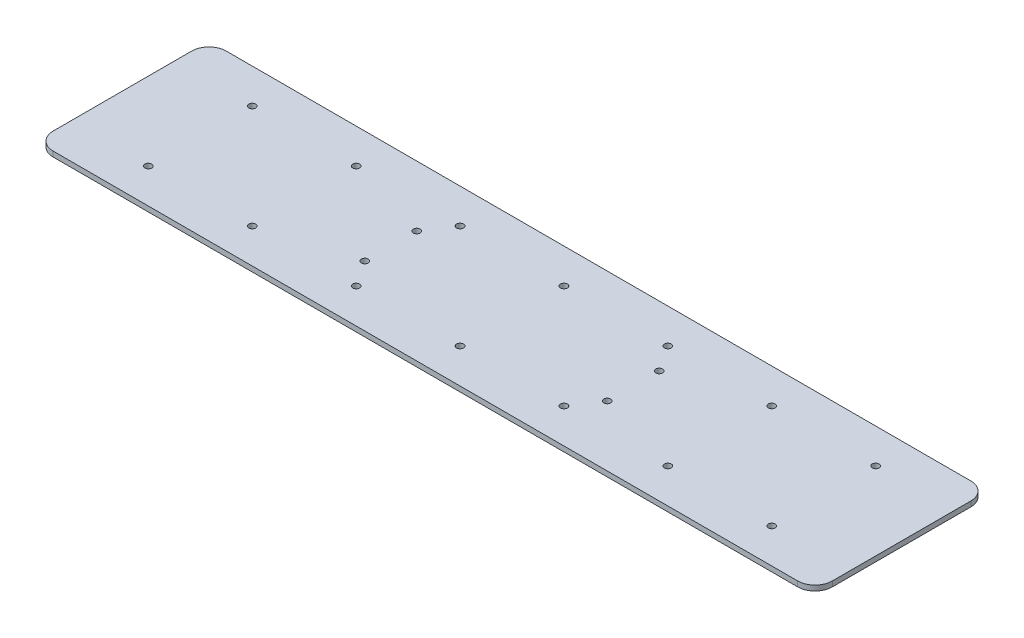
ISO-10303-21;
HEADER;
FILE_DESCRIPTION(('STEP AP214'),'2;1');
FILE_NAME('part.step','',(''),(''),'','','');
FILE_SCHEMA(('AUTOMOTIVE_DESIGN { 1 0 10303 214 1 1 1 1 }'));
ENDSEC;
DATA;
#1=APPLICATION_CONTEXT('core data for automotive mechanical design processes');
#2=APPLICATION_PROTOCOL_DEFINITION('international standard','automotive_design',2000,#1);
#3=PRODUCT_CONTEXT('',#1,'mechanical');
#4=PRODUCT('Part','Part','',(#3));
#5=PRODUCT_RELATED_PRODUCT_CATEGORY('part','',(#4));
#6=PRODUCT_DEFINITION_FORMATION('','',#4);
#7=PRODUCT_DEFINITION_CONTEXT('part definition',#1,'design');
#8=PRODUCT_DEFINITION('design','',#6,#7);
#9=PRODUCT_DEFINITION_SHAPE('','',#8);
#10=(LENGTH_UNIT() NAMED_UNIT(*) SI_UNIT(.MILLI.,.METRE.));
#11=(NAMED_UNIT(*) PLANE_ANGLE_UNIT() SI_UNIT($,.RADIAN.));
#12=(NAMED_UNIT(*) SI_UNIT($,.STERADIAN.) SOLID_ANGLE_UNIT());
#13=UNCERTAINTY_MEASURE_WITH_UNIT(LENGTH_MEASURE(1.E-05),#10,'distance_accuracy_value','');
#14=(GEOMETRIC_REPRESENTATION_CONTEXT(3) GLOBAL_UNCERTAINTY_ASSIGNED_CONTEXT((#13)) GLOBAL_UNIT_ASSIGNED_CONTEXT((#10,
#11,#12)) REPRESENTATION_CONTEXT('',''));
#15=CARTESIAN_POINT('',(0.,0.,0.));
#16=DIRECTION('',(0.,0.,1.));
#17=DIRECTION('',(1.,0.,0.));
#18=AXIS2_PLACEMENT_3D('',#15,#16,#17);
#19=CARTESIAN_POINT('',(215.,3.,40.));
#20=DIRECTION('',(0.,-1.,0.));
#21=DIRECTION('',(0.,0.,-1.));
#22=AXIS2_PLACEMENT_3D('',#19,#20,#21);
#23=CYLINDRICAL_SURFACE('',#22,10.);
#24=CARTESIAN_POINT('',(215.,0.,40.));
#25=DIRECTION('',(0.,1.,0.));
#26=DIRECTION('',(0.,0.,1.));
#27=AXIS2_PLACEMENT_3D('',#24,#25,#26);
#28=CIRCLE('',#27,10.);
#29=CARTESIAN_POINT('',(215.,0.,50.));
#30=VERTEX_POINT('',#29);
#31=CARTESIAN_POINT('',(225.,0.,39.9999999999999));
#32=VERTEX_POINT('',#31);
#33=EDGE_CURVE('E128',#30,#32,#28,.T.);
#34=ORIENTED_EDGE('',*,*,#33,.T.);
#35=DIRECTION('',(0.,-1.,0.));
#36=VECTOR('',#35,1.);
#37=CARTESIAN_POINT('',(225.,3.,39.9999999999999));
#38=LINE('',#37,#36);
#39=CARTESIAN_POINT('',(225.,3.,39.9999999999999));
#40=VERTEX_POINT('',#39);
#41=EDGE_CURVE('E11',#40,#32,#38,.T.);
#42=ORIENTED_EDGE('',*,*,#41,.F.);
#43=CARTESIAN_POINT('',(215.,3.,40.));
#44=DIRECTION('',(0.,1.,0.));
#45=DIRECTION('',(0.,0.,1.));
#46=AXIS2_PLACEMENT_3D('',#43,#44,#45);
#47=CIRCLE('',#46,10.);
#48=CARTESIAN_POINT('',(215.,3.,50.));
#49=VERTEX_POINT('',#48);
#50=EDGE_CURVE('E143',#49,#40,#47,.T.);
#51=ORIENTED_EDGE('',*,*,#50,.F.);
#52=DIRECTION('',(0.,-1.,0.));
#53=VECTOR('',#52,1.);
#54=CARTESIAN_POINT('',(215.,3.,50.));
#55=LINE('',#54,#53);
#56=EDGE_CURVE('E124',#49,#30,#55,.T.);
#57=ORIENTED_EDGE('',*,*,#56,.T.);
#58=EDGE_LOOP('',(#34,#42,#51,#57));
#59=FACE_BOUND('',#58,.T.);
#60=ADVANCED_FACE('F32',(#59),#23,.T.);
#61=CARTESIAN_POINT('',(225.,3.,-39.9999999999999));
#62=DIRECTION('',(-1.,0.,0.));
#63=DIRECTION('',(0.,0.,1.));
#64=AXIS2_PLACEMENT_3D('',#61,#62,#63);
#65=PLANE('',#64);
#66=DIRECTION('',(0.,0.,-1.));
#67=VECTOR('',#66,1.);
#68=CARTESIAN_POINT('',(225.,0.,-39.9999999999999));
#69=LINE('',#68,#67);
#70=CARTESIAN_POINT('',(225.,0.,-39.9999999999999));
#71=VERTEX_POINT('',#70);
#72=EDGE_CURVE('E131',#32,#71,#69,.T.);
#73=ORIENTED_EDGE('',*,*,#72,.T.);
#74=DIRECTION('',(0.,-1.,0.));
#75=VECTOR('',#74,1.);
#76=CARTESIAN_POINT('',(225.,3.,-39.9999999999999));
#77=LINE('',#76,#75);
#78=CARTESIAN_POINT('',(225.,3.,-39.9999999999999));
#79=VERTEX_POINT('',#78);
#80=EDGE_CURVE('E40',#79,#71,#77,.T.);
#81=ORIENTED_EDGE('',*,*,#80,.F.);
#82=DIRECTION('',(0.,0.,-1.));
#83=VECTOR('',#82,1.);
#84=CARTESIAN_POINT('',(225.,3.,-39.9999999999999));
#85=LINE('',#84,#83);
#86=EDGE_CURVE('E91',#40,#79,#85,.T.);
#87=ORIENTED_EDGE('',*,*,#86,.F.);
#88=ORIENTED_EDGE('',*,*,#41,.T.);
#89=EDGE_LOOP('',(#73,#81,#87,#88));
#90=FACE_BOUND('',#89,.T.);
#91=ADVANCED_FACE('F345',(#90),#65,.F.);
#92=CARTESIAN_POINT('',(215.,3.,-40.));
#93=DIRECTION('',(0.,-1.,0.));
#94=DIRECTION('',(0.,0.,-1.));
#95=AXIS2_PLACEMENT_3D('',#92,#93,#94);
#96=CYLINDRICAL_SURFACE('',#95,10.);
#97=CARTESIAN_POINT('',(215.,0.,-40.));
#98=DIRECTION('',(0.,1.,0.));
#99=DIRECTION('',(0.,0.,1.));
#100=AXIS2_PLACEMENT_3D('',#97,#98,#99);
#101=CIRCLE('',#100,10.);
#102=CARTESIAN_POINT('',(215.,0.,-50.));
#103=VERTEX_POINT('',#102);
#104=EDGE_CURVE('E134',#71,#103,#101,.T.);
#105=ORIENTED_EDGE('',*,*,#104,.T.);
#106=DIRECTION('',(0.,-1.,0.));
#107=VECTOR('',#106,1.);
#108=CARTESIAN_POINT('',(215.,3.,-50.));
#109=LINE('',#108,#107);
#110=CARTESIAN_POINT('',(215.,3.,-50.));
#111=VERTEX_POINT('',#110);
#112=EDGE_CURVE('E150',#111,#103,#109,.T.);
#113=ORIENTED_EDGE('',*,*,#112,.F.);
#114=CARTESIAN_POINT('',(215.,3.,-40.));
#115=DIRECTION('',(0.,1.,0.));
#116=DIRECTION('',(0.,0.,1.));
#117=AXIS2_PLACEMENT_3D('',#114,#115,#116);
#118=CIRCLE('',#117,10.);
#119=EDGE_CURVE('E158',#79,#111,#118,.T.);
#120=ORIENTED_EDGE('',*,*,#119,.F.);
#121=ORIENTED_EDGE('',*,*,#80,.T.);
#122=EDGE_LOOP('',(#105,#113,#120,#121));
#123=FACE_BOUND('',#122,.T.);
#124=ADVANCED_FACE('F156',(#123),#96,.T.);
#125=CARTESIAN_POINT('',(-215.,3.,-50.));
#126=DIRECTION('',(0.,0.,1.));
#127=DIRECTION('',(1.,0.,0.));
#128=AXIS2_PLACEMENT_3D('',#125,#126,#127);
#129=PLANE('',#128);
#130=DIRECTION('',(-1.,0.,0.));
#131=VECTOR('',#130,1.);
#132=CARTESIAN_POINT('',(-215.,0.,-50.));
#133=LINE('',#132,#131);
#134=CARTESIAN_POINT('',(-215.,0.,-50.));
#135=VERTEX_POINT('',#134);
#136=EDGE_CURVE('E136',#103,#135,#133,.T.);
#137=ORIENTED_EDGE('',*,*,#136,.T.);
#138=DIRECTION('',(0.,-1.,0.));
#139=VECTOR('',#138,1.);
#140=CARTESIAN_POINT('',(-215.,3.,-50.));
#141=LINE('',#140,#139);
#142=CARTESIAN_POINT('',(-215.,3.,-50.));
#143=VERTEX_POINT('',#142);
#144=EDGE_CURVE('E147',#143,#135,#141,.T.);
#145=ORIENTED_EDGE('',*,*,#144,.F.);
#146=DIRECTION('',(-1.,0.,0.));
#147=VECTOR('',#146,1.);
#148=CARTESIAN_POINT('',(-215.,3.,-50.));
#149=LINE('',#148,#147);
#150=EDGE_CURVE('E170',#111,#143,#149,.T.);
#151=ORIENTED_EDGE('',*,*,#150,.F.);
#152=ORIENTED_EDGE('',*,*,#112,.T.);
#153=EDGE_LOOP('',(#137,#145,#151,#152));
#154=FACE_BOUND('',#153,.T.);
#155=ADVANCED_FACE('F166',(#154),#129,.F.);
#156=CARTESIAN_POINT('',(-215.,3.,-40.));
#157=DIRECTION('',(0.,-1.,0.));
#158=DIRECTION('',(0.,0.,-1.));
#159=AXIS2_PLACEMENT_3D('',#156,#157,#158);
#160=CYLINDRICAL_SURFACE('',#159,10.);
#161=CARTESIAN_POINT('',(-215.,0.,-40.));
#162=DIRECTION('',(0.,1.,0.));
#163=DIRECTION('',(0.,0.,-1.));
#164=AXIS2_PLACEMENT_3D('',#161,#162,#163);
#165=CIRCLE('',#164,10.);
#166=CARTESIAN_POINT('',(-225.,0.,-39.9999999999999));
#167=VERTEX_POINT('',#166);
#168=EDGE_CURVE('E138',#135,#167,#165,.T.);
#169=ORIENTED_EDGE('',*,*,#168,.T.);
#170=DIRECTION('',(0.,-1.,0.));
#171=VECTOR('',#170,1.);
#172=CARTESIAN_POINT('',(-225.,3.,-39.9999999999999));
#173=LINE('',#172,#171);
#174=CARTESIAN_POINT('',(-225.,3.,-39.9999999999999));
#175=VERTEX_POINT('',#174);
#176=EDGE_CURVE('E119',#175,#167,#173,.T.);
#177=ORIENTED_EDGE('',*,*,#176,.F.);
#178=CARTESIAN_POINT('',(-215.,3.,-40.));
#179=DIRECTION('',(0.,1.,0.));
#180=DIRECTION('',(0.,0.,-1.));
#181=AXIS2_PLACEMENT_3D('',#178,#179,#180);
#182=CIRCLE('',#181,10.);
#183=EDGE_CURVE('E110',#143,#175,#182,.T.);
#184=ORIENTED_EDGE('',*,*,#183,.F.);
#185=ORIENTED_EDGE('',*,*,#144,.T.);
#186=EDGE_LOOP('',(#169,#177,#184,#185));
#187=FACE_BOUND('',#186,.T.);
#188=ADVANCED_FACE('F169',(#187),#160,.T.);
#189=CARTESIAN_POINT('',(-225.,3.,-39.9999999999999));
#190=DIRECTION('',(1.,0.,0.));
#191=DIRECTION('',(0.,0.,-1.));
#192=AXIS2_PLACEMENT_3D('',#189,#190,#191);
#193=PLANE('',#192);
#194=DIRECTION('',(0.,0.,1.));
#195=VECTOR('',#194,1.);
#196=CARTESIAN_POINT('',(-225.,0.,-39.9999999999999));
#197=LINE('',#196,#195);
#198=CARTESIAN_POINT('',(-225.,0.,39.9999999999999));
#199=VERTEX_POINT('',#198);
#200=EDGE_CURVE('E118',#167,#199,#197,.T.);
#201=ORIENTED_EDGE('',*,*,#200,.T.);
#202=DIRECTION('',(0.,-1.,0.));
#203=VECTOR('',#202,1.);
#204=CARTESIAN_POINT('',(-225.,3.,39.9999999999999));
#205=LINE('',#204,#203);
#206=CARTESIAN_POINT('',(-225.,3.,39.9999999999999));
#207=VERTEX_POINT('',#206);
#208=EDGE_CURVE('E115',#207,#199,#205,.T.);
#209=ORIENTED_EDGE('',*,*,#208,.F.);
#210=DIRECTION('',(0.,0.,1.));
#211=VECTOR('',#210,1.);
#212=CARTESIAN_POINT('',(-225.,3.,-39.9999999999999));
#213=LINE('',#212,#211);
#214=EDGE_CURVE('E104',#175,#207,#213,.T.);
#215=ORIENTED_EDGE('',*,*,#214,.F.);
#216=ORIENTED_EDGE('',*,*,#176,.T.);
#217=EDGE_LOOP('',(#201,#209,#215,#216));
#218=FACE_BOUND('',#217,.T.);
#219=ADVANCED_FACE('F116',(#218),#193,.F.);
#220=CARTESIAN_POINT('',(-215.,3.,40.));
#221=DIRECTION('',(0.,-1.,0.));
#222=DIRECTION('',(0.,0.,-1.));
#223=AXIS2_PLACEMENT_3D('',#220,#221,#222);
#224=CYLINDRICAL_SURFACE('',#223,10.);
#225=CARTESIAN_POINT('',(-215.,0.,40.));
#226=DIRECTION('',(0.,1.,0.));
#227=DIRECTION('',(0.,0.,1.));
#228=AXIS2_PLACEMENT_3D('',#225,#226,#227);
#229=CIRCLE('',#228,10.);
#230=CARTESIAN_POINT('',(-215.,0.,50.));
#231=VERTEX_POINT('',#230);
#232=EDGE_CURVE('E77',#199,#231,#229,.T.);
#233=ORIENTED_EDGE('',*,*,#232,.T.);
#234=DIRECTION('',(0.,-1.,0.));
#235=VECTOR('',#234,1.);
#236=CARTESIAN_POINT('',(-215.,3.,50.));
#237=LINE('',#236,#235);
#238=CARTESIAN_POINT('',(-215.,3.,50.));
#239=VERTEX_POINT('',#238);
#240=EDGE_CURVE('E120',#239,#231,#237,.T.);
#241=ORIENTED_EDGE('',*,*,#240,.F.);
#242=CARTESIAN_POINT('',(-215.,3.,40.));
#243=DIRECTION('',(0.,1.,0.));
#244=DIRECTION('',(0.,0.,1.));
#245=AXIS2_PLACEMENT_3D('',#242,#243,#244);
#246=CIRCLE('',#245,10.);
#247=EDGE_CURVE('E108',#207,#239,#246,.T.);
#248=ORIENTED_EDGE('',*,*,#247,.F.);
#249=ORIENTED_EDGE('',*,*,#208,.T.);
#250=EDGE_LOOP('',(#233,#241,#248,#249));
#251=FACE_BOUND('',#250,.T.);
#252=ADVANCED_FACE('F122',(#251),#224,.T.);
#253=CARTESIAN_POINT('',(-215.,3.,50.));
#254=DIRECTION('',(0.,0.,-1.));
#255=DIRECTION('',(-1.,0.,0.));
#256=AXIS2_PLACEMENT_3D('',#253,#254,#255);
#257=PLANE('',#256);
#258=DIRECTION('',(1.,0.,0.));
#259=VECTOR('',#258,1.);
#260=CARTESIAN_POINT('',(-215.,0.,50.));
#261=LINE('',#260,#259);
#262=EDGE_CURVE('E83',#231,#30,#261,.T.);
#263=ORIENTED_EDGE('',*,*,#262,.T.);
#264=ORIENTED_EDGE('',*,*,#56,.F.);
#265=DIRECTION('',(1.,0.,0.));
#266=VECTOR('',#265,1.);
#267=CARTESIAN_POINT('',(-215.,3.,50.));
#268=LINE('',#267,#266);
#269=EDGE_CURVE('E48',#239,#49,#268,.T.);
#270=ORIENTED_EDGE('',*,*,#269,.F.);
#271=ORIENTED_EDGE('',*,*,#240,.T.);
#272=EDGE_LOOP('',(#263,#264,#270,#271));
#273=FACE_BOUND('',#272,.T.);
#274=ADVANCED_FACE('F296',(#273),#257,.F.);
#275=CARTESIAN_POINT('',(215.,3.,40.));
#276=DIRECTION('',(0.,1.,0.));
#277=DIRECTION('',(0.,0.,1.));
#278=AXIS2_PLACEMENT_3D('',#275,#276,#277);
#279=PLANE('',#278);
#280=CARTESIAN_POINT('',(70.,3.,-15.));
#281=DIRECTION('',(0.,1.,0.));
#282=DIRECTION('',(0.,0.,1.));
#283=AXIS2_PLACEMENT_3D('',#280,#281,#282);
#284=CIRCLE('',#283,2.);
#285=CARTESIAN_POINT('',(70.,3.,-13.));
#286=VERTEX_POINT('',#285);
#287=EDGE_CURVE('E273',#286,#286,#284,.T.);
#288=ORIENTED_EDGE('',*,*,#287,.F.);
#289=EDGE_LOOP('',(#288));
#290=FACE_BOUND('',#289,.T.);
#291=CARTESIAN_POINT('',(-70.,3.,15.));
#292=DIRECTION('',(0.,1.,0.));
#293=DIRECTION('',(0.,0.,1.));
#294=AXIS2_PLACEMENT_3D('',#291,#292,#293);
#295=CIRCLE('',#294,2.);
#296=CARTESIAN_POINT('',(-70.,3.,17.));
#297=VERTEX_POINT('',#296);
#298=EDGE_CURVE('E266',#297,#297,#295,.T.);
#299=ORIENTED_EDGE('',*,*,#298,.F.);
#300=EDGE_LOOP('',(#299));
#301=FACE_BOUND('',#300,.T.);
#302=CARTESIAN_POINT('',(70.,3.,15.));
#303=DIRECTION('',(0.,1.,0.));
#304=DIRECTION('',(0.,0.,1.));
#305=AXIS2_PLACEMENT_3D('',#302,#303,#304);
#306=CIRCLE('',#305,2.);
#307=CARTESIAN_POINT('',(70.,3.,17.));
#308=VERTEX_POINT('',#307);
#309=EDGE_CURVE('E278',#308,#308,#306,.T.);
#310=ORIENTED_EDGE('',*,*,#309,.F.);
#311=EDGE_LOOP('',(#310));
#312=FACE_BOUND('',#311,.T.);
#313=CARTESIAN_POINT('',(-70.,3.,-15.));
#314=DIRECTION('',(0.,1.,0.));
#315=DIRECTION('',(0.,0.,1.));
#316=AXIS2_PLACEMENT_3D('',#313,#314,#315);
#317=CIRCLE('',#316,2.);
#318=CARTESIAN_POINT('',(-70.,3.,-13.));
#319=VERTEX_POINT('',#318);
#320=EDGE_CURVE('E260',#319,#319,#317,.T.);
#321=ORIENTED_EDGE('',*,*,#320,.F.);
#322=EDGE_LOOP('',(#321));
#323=FACE_BOUND('',#322,.T.);
#324=CARTESIAN_POINT('',(-180.,3.,-30.));
#325=DIRECTION('',(0.,1.,0.));
#326=DIRECTION('',(0.,0.,1.));
#327=AXIS2_PLACEMENT_3D('',#324,#325,#326);
#328=CIRCLE('',#327,2.);
#329=CARTESIAN_POINT('',(-180.,3.,-28.));
#330=VERTEX_POINT('',#329);
#331=EDGE_CURVE('E255',#330,#330,#328,.T.);
#332=ORIENTED_EDGE('',*,*,#331,.F.);
#333=EDGE_LOOP('',(#332));
#334=FACE_BOUND('',#333,.T.);
#335=CARTESIAN_POINT('',(-120.,3.,-30.));
#336=DIRECTION('',(0.,1.,0.));
#337=DIRECTION('',(0.,0.,1.));
#338=AXIS2_PLACEMENT_3D('',#335,#336,#337);
#339=CIRCLE('',#338,2.);
#340=CARTESIAN_POINT('',(-120.,3.,-28.));
#341=VERTEX_POINT('',#340);
#342=EDGE_CURVE('E249',#341,#341,#339,.T.);
#343=ORIENTED_EDGE('',*,*,#342,.F.);
#344=EDGE_LOOP('',(#343));
#345=FACE_BOUND('',#344,.T.);
#346=CARTESIAN_POINT('',(-60.,3.,-30.));
#347=DIRECTION('',(0.,1.,0.));
#348=DIRECTION('',(0.,0.,1.));
#349=AXIS2_PLACEMENT_3D('',#346,#347,#348);
#350=CIRCLE('',#349,2.);
#351=CARTESIAN_POINT('',(-60.,3.,-28.));
#352=VERTEX_POINT('',#351);
#353=EDGE_CURVE('E243',#352,#352,#350,.T.);
#354=ORIENTED_EDGE('',*,*,#353,.F.);
#355=EDGE_LOOP('',(#354));
#356=FACE_BOUND('',#355,.T.);
#357=CARTESIAN_POINT('',(0.,3.,-30.));
#358=DIRECTION('',(0.,1.,0.));
#359=DIRECTION('',(0.,0.,1.));
#360=AXIS2_PLACEMENT_3D('',#357,#358,#359);
#361=CIRCLE('',#360,2.);
#362=CARTESIAN_POINT('',(0.,3.,-28.));
#363=VERTEX_POINT('',#362);
#364=EDGE_CURVE('E237',#363,#363,#361,.T.);
#365=ORIENTED_EDGE('',*,*,#364,.F.);
#366=EDGE_LOOP('',(#365));
#367=FACE_BOUND('',#366,.T.);
#368=CARTESIAN_POINT('',(60.,3.,-30.));
#369=DIRECTION('',(0.,1.,0.));
#370=DIRECTION('',(0.,0.,1.));
#371=AXIS2_PLACEMENT_3D('',#368,#369,#370);
#372=CIRCLE('',#371,2.);
#373=CARTESIAN_POINT('',(60.,3.,-28.));
#374=VERTEX_POINT('',#373);
#375=EDGE_CURVE('E231',#374,#374,#372,.T.);
#376=ORIENTED_EDGE('',*,*,#375,.F.);
#377=EDGE_LOOP('',(#376));
#378=FACE_BOUND('',#377,.T.);
#379=CARTESIAN_POINT('',(120.,3.,-30.));
#380=DIRECTION('',(0.,1.,0.));
#381=DIRECTION('',(0.,0.,1.));
#382=AXIS2_PLACEMENT_3D('',#379,#380,#381);
#383=CIRCLE('',#382,2.);
#384=CARTESIAN_POINT('',(120.,3.,-28.));
#385=VERTEX_POINT('',#384);
#386=EDGE_CURVE('E225',#385,#385,#383,.T.);
#387=ORIENTED_EDGE('',*,*,#386,.F.);
#388=EDGE_LOOP('',(#387));
#389=FACE_BOUND('',#388,.T.);
#390=CARTESIAN_POINT('',(180.,3.,-30.));
#391=DIRECTION('',(0.,1.,0.));
#392=DIRECTION('',(0.,0.,1.));
#393=AXIS2_PLACEMENT_3D('',#390,#391,#392);
#394=CIRCLE('',#393,2.);
#395=CARTESIAN_POINT('',(180.,3.,-28.));
#396=VERTEX_POINT('',#395);
#397=EDGE_CURVE('E218',#396,#396,#394,.T.);
#398=ORIENTED_EDGE('',*,*,#397,.F.);
#399=EDGE_LOOP('',(#398));
#400=FACE_BOUND('',#399,.T.);
#401=CARTESIAN_POINT('',(-180.,3.,30.));
#402=DIRECTION('',(0.,1.,0.));
#403=DIRECTION('',(0.,0.,1.));
#404=AXIS2_PLACEMENT_3D('',#401,#402,#403);
#405=CIRCLE('',#404,2.);
#406=CARTESIAN_POINT('',(-180.,3.,32.));
#407=VERTEX_POINT('',#406);
#408=EDGE_CURVE('E213',#407,#407,#405,.T.);
#409=ORIENTED_EDGE('',*,*,#408,.F.);
#410=EDGE_LOOP('',(#409));
#411=FACE_BOUND('',#410,.T.);
#412=CARTESIAN_POINT('',(-120.,3.,30.));
#413=DIRECTION('',(0.,1.,0.));
#414=DIRECTION('',(0.,0.,1.));
#415=AXIS2_PLACEMENT_3D('',#412,#413,#414);
#416=CIRCLE('',#415,2.);
#417=CARTESIAN_POINT('',(-120.,3.,32.));
#418=VERTEX_POINT('',#417);
#419=EDGE_CURVE('E207',#418,#418,#416,.T.);
#420=ORIENTED_EDGE('',*,*,#419,.F.);
#421=EDGE_LOOP('',(#420));
#422=FACE_BOUND('',#421,.T.);
#423=CARTESIAN_POINT('',(-60.,3.,30.));
#424=DIRECTION('',(0.,1.,0.));
#425=DIRECTION('',(0.,0.,1.));
#426=AXIS2_PLACEMENT_3D('',#423,#424,#425);
#427=CIRCLE('',#426,2.);
#428=CARTESIAN_POINT('',(-60.,3.,32.));
#429=VERTEX_POINT('',#428);
#430=EDGE_CURVE('E201',#429,#429,#427,.T.);
#431=ORIENTED_EDGE('',*,*,#430,.F.);
#432=EDGE_LOOP('',(#431));
#433=FACE_BOUND('',#432,.T.);
#434=CARTESIAN_POINT('',(0.,3.,30.));
#435=DIRECTION('',(0.,1.,0.));
#436=DIRECTION('',(0.,0.,1.));
#437=AXIS2_PLACEMENT_3D('',#434,#435,#436);
#438=CIRCLE('',#437,2.);
#439=CARTESIAN_POINT('',(0.,3.,32.));
#440=VERTEX_POINT('',#439);
#441=EDGE_CURVE('E195',#440,#440,#438,.T.);
#442=ORIENTED_EDGE('',*,*,#441,.F.);
#443=EDGE_LOOP('',(#442));
#444=FACE_BOUND('',#443,.T.);
#445=CARTESIAN_POINT('',(60.,3.,30.));
#446=DIRECTION('',(0.,1.,0.));
#447=DIRECTION('',(0.,0.,1.));
#448=AXIS2_PLACEMENT_3D('',#445,#446,#447);
#449=CIRCLE('',#448,2.);
#450=CARTESIAN_POINT('',(60.,3.,32.));
#451=VERTEX_POINT('',#450);
#452=EDGE_CURVE('E189',#451,#451,#449,.T.);
#453=ORIENTED_EDGE('',*,*,#452,.F.);
#454=EDGE_LOOP('',(#453));
#455=FACE_BOUND('',#454,.T.);
#456=CARTESIAN_POINT('',(120.,3.,30.));
#457=DIRECTION('',(0.,1.,0.));
#458=DIRECTION('',(0.,0.,1.));
#459=AXIS2_PLACEMENT_3D('',#456,#457,#458);
#460=CIRCLE('',#459,2.);
#461=CARTESIAN_POINT('',(120.,3.,32.));
#462=VERTEX_POINT('',#461);
#463=EDGE_CURVE('E183',#462,#462,#460,.T.);
#464=ORIENTED_EDGE('',*,*,#463,.F.);
#465=EDGE_LOOP('',(#464));
#466=FACE_BOUND('',#465,.T.);
#467=CARTESIAN_POINT('',(180.,3.,30.));
#468=DIRECTION('',(0.,1.,0.));
#469=DIRECTION('',(0.,0.,1.));
#470=AXIS2_PLACEMENT_3D('',#467,#468,#469);
#471=CIRCLE('',#470,2.);
#472=CARTESIAN_POINT('',(180.,3.,32.));
#473=VERTEX_POINT('',#472);
#474=EDGE_CURVE('E176',#473,#473,#471,.T.);
#475=ORIENTED_EDGE('',*,*,#474,.F.);
#476=EDGE_LOOP('',(#475));
#477=FACE_BOUND('',#476,.T.);
#478=ORIENTED_EDGE('',*,*,#50,.T.);
#479=ORIENTED_EDGE('',*,*,#86,.T.);
#480=ORIENTED_EDGE('',*,*,#119,.T.);
#481=ORIENTED_EDGE('',*,*,#150,.T.);
#482=ORIENTED_EDGE('',*,*,#183,.T.);
#483=ORIENTED_EDGE('',*,*,#214,.T.);
#484=ORIENTED_EDGE('',*,*,#247,.T.);
#485=ORIENTED_EDGE('',*,*,#269,.T.);
#486=EDGE_LOOP('',(#478,#479,#480,#481,#482,#483,#484,#485));
#487=FACE_BOUND('',#486,.T.);
#488=ADVANCED_FACE('F106',(#290,#301,#312,#323,#334,#345,#356,#367,#378,#389,#400,#411,#422,
#433,#444,#455,#466,#477,#487),#279,.T.);
#489=CARTESIAN_POINT('',(215.,0.,40.));
#490=DIRECTION('',(0.,1.,0.));
#491=DIRECTION('',(0.,0.,1.));
#492=AXIS2_PLACEMENT_3D('',#489,#490,#491);
#493=PLANE('',#492);
#494=CARTESIAN_POINT('',(70.,0.,-15.));
#495=DIRECTION('',(0.,1.,0.));
#496=DIRECTION('',(0.,0.,1.));
#497=AXIS2_PLACEMENT_3D('',#494,#495,#496);
#498=CIRCLE('',#497,2.);
#499=CARTESIAN_POINT('',(70.,0.,-13.));
#500=VERTEX_POINT('',#499);
#501=EDGE_CURVE('E263',#500,#500,#498,.T.);
#502=ORIENTED_EDGE('',*,*,#501,.T.);
#503=EDGE_LOOP('',(#502));
#504=FACE_BOUND('',#503,.T.);
#505=CARTESIAN_POINT('',(-70.,0.,15.));
#506=DIRECTION('',(0.,1.,0.));
#507=DIRECTION('',(0.,0.,1.));
#508=AXIS2_PLACEMENT_3D('',#505,#506,#507);
#509=CIRCLE('',#508,2.);
#510=CARTESIAN_POINT('',(-70.,0.,17.));
#511=VERTEX_POINT('',#510);
#512=EDGE_CURVE('E269',#511,#511,#509,.T.);
#513=ORIENTED_EDGE('',*,*,#512,.T.);
#514=EDGE_LOOP('',(#513));
#515=FACE_BOUND('',#514,.T.);
#516=CARTESIAN_POINT('',(70.,0.,15.));
#517=DIRECTION('',(0.,1.,0.));
#518=DIRECTION('',(0.,0.,1.));
#519=AXIS2_PLACEMENT_3D('',#516,#517,#518);
#520=CIRCLE('',#519,2.);
#521=CARTESIAN_POINT('',(70.,0.,17.));
#522=VERTEX_POINT('',#521);
#523=EDGE_CURVE('E270',#522,#522,#520,.T.);
#524=ORIENTED_EDGE('',*,*,#523,.T.);
#525=EDGE_LOOP('',(#524));
#526=FACE_BOUND('',#525,.T.);
#527=CARTESIAN_POINT('',(-70.,0.,-15.));
#528=DIRECTION('',(0.,1.,0.));
#529=DIRECTION('',(0.,0.,1.));
#530=AXIS2_PLACEMENT_3D('',#527,#528,#529);
#531=CIRCLE('',#530,2.);
#532=CARTESIAN_POINT('',(-70.,0.,-13.));
#533=VERTEX_POINT('',#532);
#534=EDGE_CURVE('E222',#533,#533,#531,.T.);
#535=ORIENTED_EDGE('',*,*,#534,.T.);
#536=EDGE_LOOP('',(#535));
#537=FACE_BOUND('',#536,.T.);
#538=CARTESIAN_POINT('',(-180.,0.,-30.));
#539=DIRECTION('',(0.,1.,0.));
#540=DIRECTION('',(0.,0.,1.));
#541=AXIS2_PLACEMENT_3D('',#538,#539,#540);
#542=CIRCLE('',#541,2.);
#543=CARTESIAN_POINT('',(-180.,0.,-28.));
#544=VERTEX_POINT('',#543);
#545=EDGE_CURVE('E180',#544,#544,#542,.T.);
#546=ORIENTED_EDGE('',*,*,#545,.T.);
#547=EDGE_LOOP('',(#546));
#548=FACE_BOUND('',#547,.T.);
#549=CARTESIAN_POINT('',(-120.,0.,-30.));
#550=DIRECTION('',(0.,1.,0.));
#551=DIRECTION('',(0.,0.,1.));
#552=AXIS2_PLACEMENT_3D('',#549,#550,#551);
#553=CIRCLE('',#552,2.);
#554=CARTESIAN_POINT('',(-120.,0.,-28.));
#555=VERTEX_POINT('',#554);
#556=EDGE_CURVE('E252',#555,#555,#553,.T.);
#557=ORIENTED_EDGE('',*,*,#556,.T.);
#558=EDGE_LOOP('',(#557));
#559=FACE_BOUND('',#558,.T.);
#560=CARTESIAN_POINT('',(-60.,0.,-30.));
#561=DIRECTION('',(0.,1.,0.));
#562=DIRECTION('',(0.,0.,1.));
#563=AXIS2_PLACEMENT_3D('',#560,#561,#562);
#564=CIRCLE('',#563,2.);
#565=CARTESIAN_POINT('',(-60.,0.,-28.));
#566=VERTEX_POINT('',#565);
#567=EDGE_CURVE('E246',#566,#566,#564,.T.);
#568=ORIENTED_EDGE('',*,*,#567,.T.);
#569=EDGE_LOOP('',(#568));
#570=FACE_BOUND('',#569,.T.);
#571=CARTESIAN_POINT('',(0.,0.,-30.));
#572=DIRECTION('',(0.,1.,0.));
#573=DIRECTION('',(0.,0.,1.));
#574=AXIS2_PLACEMENT_3D('',#571,#572,#573);
#575=CIRCLE('',#574,2.);
#576=CARTESIAN_POINT('',(0.,0.,-28.));
#577=VERTEX_POINT('',#576);
#578=EDGE_CURVE('E240',#577,#577,#575,.T.);
#579=ORIENTED_EDGE('',*,*,#578,.T.);
#580=EDGE_LOOP('',(#579));
#581=FACE_BOUND('',#580,.T.);
#582=CARTESIAN_POINT('',(60.,0.,-30.));
#583=DIRECTION('',(0.,1.,0.));
#584=DIRECTION('',(0.,0.,1.));
#585=AXIS2_PLACEMENT_3D('',#582,#583,#584);
#586=CIRCLE('',#585,2.);
#587=CARTESIAN_POINT('',(60.,0.,-28.));
#588=VERTEX_POINT('',#587);
#589=EDGE_CURVE('E234',#588,#588,#586,.T.);
#590=ORIENTED_EDGE('',*,*,#589,.T.);
#591=EDGE_LOOP('',(#590));
#592=FACE_BOUND('',#591,.T.);
#593=CARTESIAN_POINT('',(120.,0.,-30.));
#594=DIRECTION('',(0.,1.,0.));
#595=DIRECTION('',(0.,0.,1.));
#596=AXIS2_PLACEMENT_3D('',#593,#594,#595);
#597=CIRCLE('',#596,2.);
#598=CARTESIAN_POINT('',(120.,0.,-28.));
#599=VERTEX_POINT('',#598);
#600=EDGE_CURVE('E228',#599,#599,#597,.T.);
#601=ORIENTED_EDGE('',*,*,#600,.T.);
#602=EDGE_LOOP('',(#601));
#603=FACE_BOUND('',#602,.T.);
#604=CARTESIAN_POINT('',(180.,0.,-30.));
#605=DIRECTION('',(0.,1.,0.));
#606=DIRECTION('',(0.,0.,1.));
#607=AXIS2_PLACEMENT_3D('',#604,#605,#606);
#608=CIRCLE('',#607,2.);
#609=CARTESIAN_POINT('',(180.,0.,-28.));
#610=VERTEX_POINT('',#609);
#611=EDGE_CURVE('E221',#610,#610,#608,.T.);
#612=ORIENTED_EDGE('',*,*,#611,.T.);
#613=EDGE_LOOP('',(#612));
#614=FACE_BOUND('',#613,.T.);
#615=CARTESIAN_POINT('',(-180.,0.,30.));
#616=DIRECTION('',(0.,1.,0.));
#617=DIRECTION('',(0.,0.,1.));
#618=AXIS2_PLACEMENT_3D('',#615,#616,#617);
#619=CIRCLE('',#618,2.);
#620=CARTESIAN_POINT('',(-180.,0.,32.));
#621=VERTEX_POINT('',#620);
#622=EDGE_CURVE('E132',#621,#621,#619,.T.);
#623=ORIENTED_EDGE('',*,*,#622,.T.);
#624=EDGE_LOOP('',(#623));
#625=FACE_BOUND('',#624,.T.);
#626=CARTESIAN_POINT('',(-120.,0.,30.));
#627=DIRECTION('',(0.,1.,0.));
#628=DIRECTION('',(0.,0.,1.));
#629=AXIS2_PLACEMENT_3D('',#626,#627,#628);
#630=CIRCLE('',#629,2.);
#631=CARTESIAN_POINT('',(-120.,0.,32.));
#632=VERTEX_POINT('',#631);
#633=EDGE_CURVE('E210',#632,#632,#630,.T.);
#634=ORIENTED_EDGE('',*,*,#633,.T.);
#635=EDGE_LOOP('',(#634));
#636=FACE_BOUND('',#635,.T.);
#637=CARTESIAN_POINT('',(-60.,0.,30.));
#638=DIRECTION('',(0.,1.,0.));
#639=DIRECTION('',(0.,0.,1.));
#640=AXIS2_PLACEMENT_3D('',#637,#638,#639);
#641=CIRCLE('',#640,2.);
#642=CARTESIAN_POINT('',(-60.,0.,32.));
#643=VERTEX_POINT('',#642);
#644=EDGE_CURVE('E204',#643,#643,#641,.T.);
#645=ORIENTED_EDGE('',*,*,#644,.T.);
#646=EDGE_LOOP('',(#645));
#647=FACE_BOUND('',#646,.T.);
#648=CARTESIAN_POINT('',(0.,0.,30.));
#649=DIRECTION('',(0.,1.,0.));
#650=DIRECTION('',(0.,0.,1.));
#651=AXIS2_PLACEMENT_3D('',#648,#649,#650);
#652=CIRCLE('',#651,2.);
#653=CARTESIAN_POINT('',(0.,0.,32.));
#654=VERTEX_POINT('',#653);
#655=EDGE_CURVE('E198',#654,#654,#652,.T.);
#656=ORIENTED_EDGE('',*,*,#655,.T.);
#657=EDGE_LOOP('',(#656));
#658=FACE_BOUND('',#657,.T.);
#659=CARTESIAN_POINT('',(60.,0.,30.));
#660=DIRECTION('',(0.,1.,0.));
#661=DIRECTION('',(0.,0.,1.));
#662=AXIS2_PLACEMENT_3D('',#659,#660,#661);
#663=CIRCLE('',#662,2.);
#664=CARTESIAN_POINT('',(60.,0.,32.));
#665=VERTEX_POINT('',#664);
#666=EDGE_CURVE('E192',#665,#665,#663,.T.);
#667=ORIENTED_EDGE('',*,*,#666,.T.);
#668=EDGE_LOOP('',(#667));
#669=FACE_BOUND('',#668,.T.);
#670=CARTESIAN_POINT('',(120.,0.,30.));
#671=DIRECTION('',(0.,1.,0.));
#672=DIRECTION('',(0.,0.,1.));
#673=AXIS2_PLACEMENT_3D('',#670,#671,#672);
#674=CIRCLE('',#673,2.);
#675=CARTESIAN_POINT('',(120.,0.,32.));
#676=VERTEX_POINT('',#675);
#677=EDGE_CURVE('E186',#676,#676,#674,.T.);
#678=ORIENTED_EDGE('',*,*,#677,.T.);
#679=EDGE_LOOP('',(#678));
#680=FACE_BOUND('',#679,.T.);
#681=CARTESIAN_POINT('',(180.,0.,30.));
#682=DIRECTION('',(0.,1.,0.));
#683=DIRECTION('',(0.,0.,1.));
#684=AXIS2_PLACEMENT_3D('',#681,#682,#683);
#685=CIRCLE('',#684,2.);
#686=CARTESIAN_POINT('',(180.,0.,32.));
#687=VERTEX_POINT('',#686);
#688=EDGE_CURVE('E179',#687,#687,#685,.T.);
#689=ORIENTED_EDGE('',*,*,#688,.T.);
#690=EDGE_LOOP('',(#689));
#691=FACE_BOUND('',#690,.T.);
#692=ORIENTED_EDGE('',*,*,#33,.F.);
#693=ORIENTED_EDGE('',*,*,#262,.F.);
#694=ORIENTED_EDGE('',*,*,#232,.F.);
#695=ORIENTED_EDGE('',*,*,#200,.F.);
#696=ORIENTED_EDGE('',*,*,#168,.F.);
#697=ORIENTED_EDGE('',*,*,#136,.F.);
#698=ORIENTED_EDGE('',*,*,#104,.F.);
#699=ORIENTED_EDGE('',*,*,#72,.F.);
#700=EDGE_LOOP('',(#692,#693,#694,#695,#696,#697,#698,#699));
#701=FACE_BOUND('',#700,.T.);
#702=ADVANCED_FACE('F162',(#504,#515,#526,#537,#548,#559,#570,#581,#592,#603,#614,#625,#636,
#647,#658,#669,#680,#691,#701),#493,.F.);
#703=CARTESIAN_POINT('',(180.,0.,30.));
#704=DIRECTION('',(0.,1.,0.));
#705=DIRECTION('',(0.,0.,1.));
#706=AXIS2_PLACEMENT_3D('',#703,#704,#705);
#707=CYLINDRICAL_SURFACE('',#706,2.);
#708=ORIENTED_EDGE('',*,*,#688,.F.);
#709=EDGE_LOOP('',(#708));
#710=FACE_BOUND('',#709,.T.);
#711=ORIENTED_EDGE('',*,*,#474,.T.);
#712=EDGE_LOOP('',(#711));
#713=FACE_BOUND('',#712,.T.);
#714=ADVANCED_FACE('F329',(#710,#713),#707,.F.);
#715=CARTESIAN_POINT('',(120.,0.,30.));
#716=DIRECTION('',(0.,1.,0.));
#717=DIRECTION('',(0.,0.,1.));
#718=AXIS2_PLACEMENT_3D('',#715,#716,#717);
#719=CYLINDRICAL_SURFACE('',#718,2.);
#720=ORIENTED_EDGE('',*,*,#677,.F.);
#721=EDGE_LOOP('',(#720));
#722=FACE_BOUND('',#721,.T.);
#723=ORIENTED_EDGE('',*,*,#463,.T.);
#724=EDGE_LOOP('',(#723));
#725=FACE_BOUND('',#724,.T.);
#726=ADVANCED_FACE('F331',(#722,#725),#719,.F.);
#727=CARTESIAN_POINT('',(60.,0.,30.));
#728=DIRECTION('',(0.,1.,0.));
#729=DIRECTION('',(0.,0.,1.));
#730=AXIS2_PLACEMENT_3D('',#727,#728,#729);
#731=CYLINDRICAL_SURFACE('',#730,2.);
#732=ORIENTED_EDGE('',*,*,#666,.F.);
#733=EDGE_LOOP('',(#732));
#734=FACE_BOUND('',#733,.T.);
#735=ORIENTED_EDGE('',*,*,#452,.T.);
#736=EDGE_LOOP('',(#735));
#737=FACE_BOUND('',#736,.T.);
#738=ADVANCED_FACE('F338',(#734,#737),#731,.F.);
#739=CARTESIAN_POINT('',(0.,0.,30.));
#740=DIRECTION('',(0.,1.,0.));
#741=DIRECTION('',(0.,0.,1.));
#742=AXIS2_PLACEMENT_3D('',#739,#740,#741);
#743=CYLINDRICAL_SURFACE('',#742,2.);
#744=ORIENTED_EDGE('',*,*,#655,.F.);
#745=EDGE_LOOP('',(#744));
#746=FACE_BOUND('',#745,.T.);
#747=ORIENTED_EDGE('',*,*,#441,.T.);
#748=EDGE_LOOP('',(#747));
#749=FACE_BOUND('',#748,.T.);
#750=ADVANCED_FACE('F411',(#746,#749),#743,.F.);
#751=CARTESIAN_POINT('',(-60.,0.,30.));
#752=DIRECTION('',(0.,1.,0.));
#753=DIRECTION('',(0.,0.,1.));
#754=AXIS2_PLACEMENT_3D('',#751,#752,#753);
#755=CYLINDRICAL_SURFACE('',#754,2.);
#756=ORIENTED_EDGE('',*,*,#644,.F.);
#757=EDGE_LOOP('',(#756));
#758=FACE_BOUND('',#757,.T.);
#759=ORIENTED_EDGE('',*,*,#430,.T.);
#760=EDGE_LOOP('',(#759));
#761=FACE_BOUND('',#760,.T.);
#762=ADVANCED_FACE('F421',(#758,#761),#755,.F.);
#763=CARTESIAN_POINT('',(-120.,0.,30.));
#764=DIRECTION('',(0.,1.,0.));
#765=DIRECTION('',(0.,0.,1.));
#766=AXIS2_PLACEMENT_3D('',#763,#764,#765);
#767=CYLINDRICAL_SURFACE('',#766,2.);
#768=ORIENTED_EDGE('',*,*,#633,.F.);
#769=EDGE_LOOP('',(#768));
#770=FACE_BOUND('',#769,.T.);
#771=ORIENTED_EDGE('',*,*,#419,.T.);
#772=EDGE_LOOP('',(#771));
#773=FACE_BOUND('',#772,.T.);
#774=ADVANCED_FACE('F431',(#770,#773),#767,.F.);
#775=CARTESIAN_POINT('',(-180.,0.,30.));
#776=DIRECTION('',(0.,1.,0.));
#777=DIRECTION('',(0.,0.,1.));
#778=AXIS2_PLACEMENT_3D('',#775,#776,#777);
#779=CYLINDRICAL_SURFACE('',#778,2.);
#780=ORIENTED_EDGE('',*,*,#622,.F.);
#781=EDGE_LOOP('',(#780));
#782=FACE_BOUND('',#781,.T.);
#783=ORIENTED_EDGE('',*,*,#408,.T.);
#784=EDGE_LOOP('',(#783));
#785=FACE_BOUND('',#784,.T.);
#786=ADVANCED_FACE('F441',(#782,#785),#779,.F.);
#787=CARTESIAN_POINT('',(180.,0.,-30.));
#788=DIRECTION('',(0.,1.,0.));
#789=DIRECTION('',(0.,0.,1.));
#790=AXIS2_PLACEMENT_3D('',#787,#788,#789);
#791=CYLINDRICAL_SURFACE('',#790,2.);
#792=ORIENTED_EDGE('',*,*,#611,.F.);
#793=EDGE_LOOP('',(#792));
#794=FACE_BOUND('',#793,.T.);
#795=ORIENTED_EDGE('',*,*,#397,.T.);
#796=EDGE_LOOP('',(#795));
#797=FACE_BOUND('',#796,.T.);
#798=ADVANCED_FACE('F451',(#794,#797),#791,.F.);
#799=CARTESIAN_POINT('',(120.,0.,-30.));
#800=DIRECTION('',(0.,1.,0.));
#801=DIRECTION('',(0.,0.,1.));
#802=AXIS2_PLACEMENT_3D('',#799,#800,#801);
#803=CYLINDRICAL_SURFACE('',#802,2.);
#804=ORIENTED_EDGE('',*,*,#600,.F.);
#805=EDGE_LOOP('',(#804));
#806=FACE_BOUND('',#805,.T.);
#807=ORIENTED_EDGE('',*,*,#386,.T.);
#808=EDGE_LOOP('',(#807));
#809=FACE_BOUND('',#808,.T.);
#810=ADVANCED_FACE('F461',(#806,#809),#803,.F.);
#811=CARTESIAN_POINT('',(60.,0.,-30.));
#812=DIRECTION('',(0.,1.,0.));
#813=DIRECTION('',(0.,0.,1.));
#814=AXIS2_PLACEMENT_3D('',#811,#812,#813);
#815=CYLINDRICAL_SURFACE('',#814,2.);
#816=ORIENTED_EDGE('',*,*,#589,.F.);
#817=EDGE_LOOP('',(#816));
#818=FACE_BOUND('',#817,.T.);
#819=ORIENTED_EDGE('',*,*,#375,.T.);
#820=EDGE_LOOP('',(#819));
#821=FACE_BOUND('',#820,.T.);
#822=ADVANCED_FACE('F471',(#818,#821),#815,.F.);
#823=CARTESIAN_POINT('',(0.,0.,-30.));
#824=DIRECTION('',(0.,1.,0.));
#825=DIRECTION('',(0.,0.,1.));
#826=AXIS2_PLACEMENT_3D('',#823,#824,#825);
#827=CYLINDRICAL_SURFACE('',#826,2.);
#828=ORIENTED_EDGE('',*,*,#578,.F.);
#829=EDGE_LOOP('',(#828));
#830=FACE_BOUND('',#829,.T.);
#831=ORIENTED_EDGE('',*,*,#364,.T.);
#832=EDGE_LOOP('',(#831));
#833=FACE_BOUND('',#832,.T.);
#834=ADVANCED_FACE('F481',(#830,#833),#827,.F.);
#835=CARTESIAN_POINT('',(-60.,0.,-30.));
#836=DIRECTION('',(0.,1.,0.));
#837=DIRECTION('',(0.,0.,1.));
#838=AXIS2_PLACEMENT_3D('',#835,#836,#837);
#839=CYLINDRICAL_SURFACE('',#838,2.);
#840=ORIENTED_EDGE('',*,*,#567,.F.);
#841=EDGE_LOOP('',(#840));
#842=FACE_BOUND('',#841,.T.);
#843=ORIENTED_EDGE('',*,*,#353,.T.);
#844=EDGE_LOOP('',(#843));
#845=FACE_BOUND('',#844,.T.);
#846=ADVANCED_FACE('F491',(#842,#845),#839,.F.);
#847=CARTESIAN_POINT('',(-120.,0.,-30.));
#848=DIRECTION('',(0.,1.,0.));
#849=DIRECTION('',(0.,0.,1.));
#850=AXIS2_PLACEMENT_3D('',#847,#848,#849);
#851=CYLINDRICAL_SURFACE('',#850,2.);
#852=ORIENTED_EDGE('',*,*,#556,.F.);
#853=EDGE_LOOP('',(#852));
#854=FACE_BOUND('',#853,.T.);
#855=ORIENTED_EDGE('',*,*,#342,.T.);
#856=EDGE_LOOP('',(#855));
#857=FACE_BOUND('',#856,.T.);
#858=ADVANCED_FACE('F501',(#854,#857),#851,.F.);
#859=CARTESIAN_POINT('',(-180.,0.,-30.));
#860=DIRECTION('',(0.,1.,0.));
#861=DIRECTION('',(0.,0.,1.));
#862=AXIS2_PLACEMENT_3D('',#859,#860,#861);
#863=CYLINDRICAL_SURFACE('',#862,2.);
#864=ORIENTED_EDGE('',*,*,#545,.F.);
#865=EDGE_LOOP('',(#864));
#866=FACE_BOUND('',#865,.T.);
#867=ORIENTED_EDGE('',*,*,#331,.T.);
#868=EDGE_LOOP('',(#867));
#869=FACE_BOUND('',#868,.T.);
#870=ADVANCED_FACE('F511',(#866,#869),#863,.F.);
#871=CARTESIAN_POINT('',(-70.,0.,-15.));
#872=DIRECTION('',(0.,1.,0.));
#873=DIRECTION('',(0.,0.,1.));
#874=AXIS2_PLACEMENT_3D('',#871,#872,#873);
#875=CYLINDRICAL_SURFACE('',#874,2.);
#876=ORIENTED_EDGE('',*,*,#534,.F.);
#877=EDGE_LOOP('',(#876));
#878=FACE_BOUND('',#877,.T.);
#879=ORIENTED_EDGE('',*,*,#320,.T.);
#880=EDGE_LOOP('',(#879));
#881=FACE_BOUND('',#880,.T.);
#882=ADVANCED_FACE('F290',(#878,#881),#875,.F.);
#883=CARTESIAN_POINT('',(70.,0.,15.));
#884=DIRECTION('',(0.,1.,0.));
#885=DIRECTION('',(0.,0.,1.));
#886=AXIS2_PLACEMENT_3D('',#883,#884,#885);
#887=CYLINDRICAL_SURFACE('',#886,2.);
#888=ORIENTED_EDGE('',*,*,#523,.F.);
#889=EDGE_LOOP('',(#888));
#890=FACE_BOUND('',#889,.T.);
#891=ORIENTED_EDGE('',*,*,#309,.T.);
#892=EDGE_LOOP('',(#891));
#893=FACE_BOUND('',#892,.T.);
#894=ADVANCED_FACE('F286',(#890,#893),#887,.F.);
#895=CARTESIAN_POINT('',(-70.,0.,15.));
#896=DIRECTION('',(0.,1.,0.));
#897=DIRECTION('',(0.,0.,1.));
#898=AXIS2_PLACEMENT_3D('',#895,#896,#897);
#899=CYLINDRICAL_SURFACE('',#898,2.);
#900=ORIENTED_EDGE('',*,*,#512,.F.);
#901=EDGE_LOOP('',(#900));
#902=FACE_BOUND('',#901,.T.);
#903=ORIENTED_EDGE('',*,*,#298,.T.);
#904=EDGE_LOOP('',(#903));
#905=FACE_BOUND('',#904,.T.);
#906=ADVANCED_FACE('F289',(#902,#905),#899,.F.);
#907=CARTESIAN_POINT('',(70.,0.,-15.));
#908=DIRECTION('',(0.,1.,0.));
#909=DIRECTION('',(0.,0.,1.));
#910=AXIS2_PLACEMENT_3D('',#907,#908,#909);
#911=CYLINDRICAL_SURFACE('',#910,2.);
#912=ORIENTED_EDGE('',*,*,#501,.F.);
#913=EDGE_LOOP('',(#912));
#914=FACE_BOUND('',#913,.T.);
#915=ORIENTED_EDGE('',*,*,#287,.T.);
#916=EDGE_LOOP('',(#915));
#917=FACE_BOUND('',#916,.T.);
#918=ADVANCED_FACE('F555',(#914,#917),#911,.F.);
#919=CLOSED_SHELL('',(#60,#91,#124,#155,#188,#219,#252,#274,#488,#702,#714,#726,#738,#750,#762,
#774,#786,#798,#810,#822,#834,#846,#858,#870,#882,#894,#906,#918));
#920=MANIFOLD_SOLID_BREP('B2',#919);
#921=ADVANCED_BREP_SHAPE_REPRESENTATION('',(#18,#920),#14);
#922=SHAPE_DEFINITION_REPRESENTATION(#9,#921);
ENDSEC;
END-ISO-10303-21;
